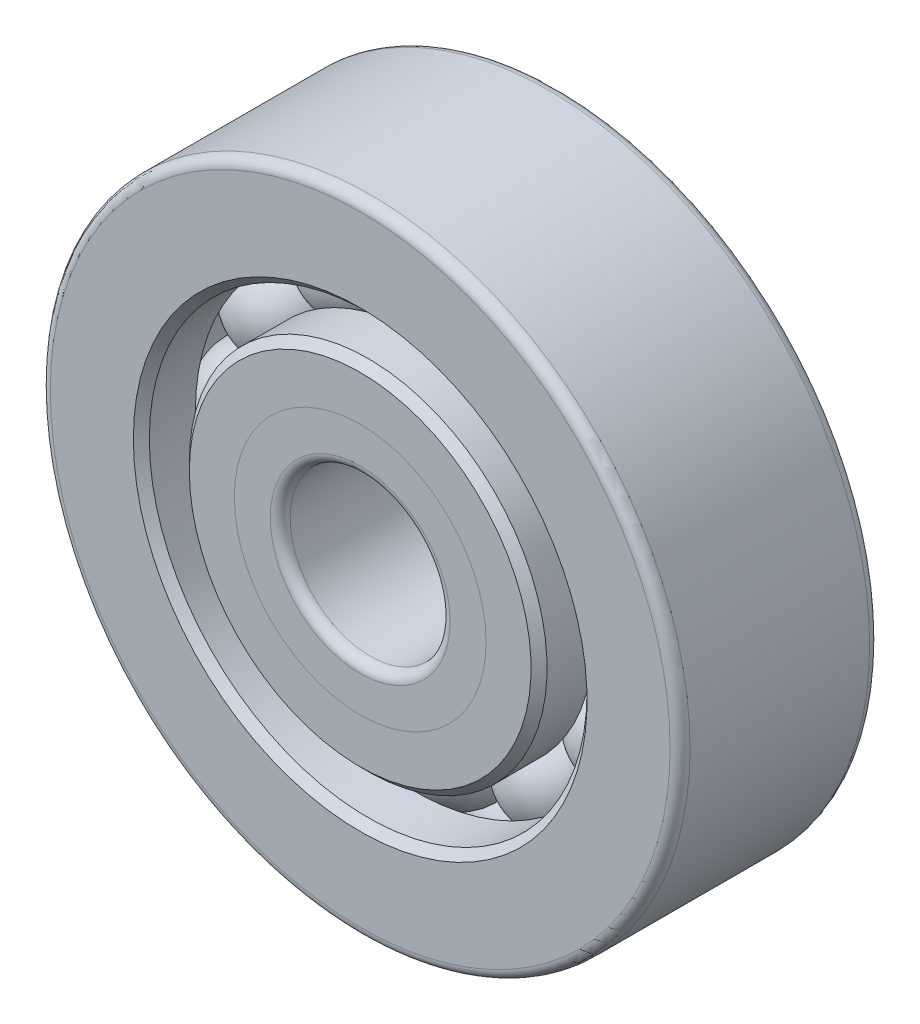
ISO-10303-21;
HEADER;
FILE_DESCRIPTION(('STEP AP214'),'2;1');
FILE_NAME('part.step','',(''),(''),'','','');
FILE_SCHEMA(('AUTOMOTIVE_DESIGN { 1 0 10303 214 1 1 1 1 }'));
ENDSEC;
DATA;
#1=APPLICATION_CONTEXT('core data for automotive mechanical design processes');
#2=APPLICATION_PROTOCOL_DEFINITION('international standard','automotive_design',2000,#1);
#3=PRODUCT_CONTEXT('',#1,'mechanical');
#4=PRODUCT('Part','Part','',(#3));
#5=PRODUCT_RELATED_PRODUCT_CATEGORY('part','',(#4));
#6=PRODUCT_DEFINITION_FORMATION('','',#4);
#7=PRODUCT_DEFINITION_CONTEXT('part definition',#1,'design');
#8=PRODUCT_DEFINITION('design','',#6,#7);
#9=PRODUCT_DEFINITION_SHAPE('','',#8);
#10=(LENGTH_UNIT() NAMED_UNIT(*) SI_UNIT(.MILLI.,.METRE.));
#11=(NAMED_UNIT(*) PLANE_ANGLE_UNIT() SI_UNIT($,.RADIAN.));
#12=(NAMED_UNIT(*) SI_UNIT($,.STERADIAN.) SOLID_ANGLE_UNIT());
#13=UNCERTAINTY_MEASURE_WITH_UNIT(LENGTH_MEASURE(1.E-05),#10,'distance_accuracy_value','');
#14=(GEOMETRIC_REPRESENTATION_CONTEXT(3) GLOBAL_UNCERTAINTY_ASSIGNED_CONTEXT((#13)) GLOBAL_UNIT_ASSIGNED_CONTEXT((#10,
#11,#12)) REPRESENTATION_CONTEXT('',''));
#15=CARTESIAN_POINT('',(0.,0.,0.));
#16=DIRECTION('',(0.,0.,1.));
#17=DIRECTION('',(1.,0.,0.));
#18=AXIS2_PLACEMENT_3D('',#15,#16,#17);
#19=CARTESIAN_POINT('',(0.,0.,-3.9724));
#20=DIRECTION('',(0.,0.,1.));
#21=DIRECTION('',(1.,0.,0.));
#22=AXIS2_PLACEMENT_3D('',#19,#20,#21);
#23=CYLINDRICAL_SURFACE('',#22,4.99872);
#24=CARTESIAN_POINT('',(0.,0.,-3.9624));
#25=DIRECTION('',(0.,0.,1.));
#26=DIRECTION('',(1.,0.,0.));
#27=AXIS2_PLACEMENT_3D('',#24,#25,#26);
#28=CIRCLE('',#27,4.99872);
#29=CARTESIAN_POINT('',(4.99872,0.,-3.9624));
#30=VERTEX_POINT('',#29);
#31=EDGE_CURVE('E78',#30,#30,#28,.T.);
#32=ORIENTED_EDGE('',*,*,#31,.T.);
#33=EDGE_LOOP('',(#32));
#34=FACE_BOUND('',#33,.T.);
#35=CARTESIAN_POINT('',(0.,0.,3.9624));
#36=DIRECTION('',(0.,0.,-1.));
#37=DIRECTION('',(-1.,0.,0.));
#38=AXIS2_PLACEMENT_3D('',#35,#36,#37);
#39=CIRCLE('',#38,4.99872);
#40=CARTESIAN_POINT('',(-4.99872,0.,3.9624));
#41=VERTEX_POINT('',#40);
#42=EDGE_CURVE('E62',#41,#41,#39,.T.);
#43=ORIENTED_EDGE('',*,*,#42,.T.);
#44=EDGE_LOOP('',(#43));
#45=FACE_BOUND('',#44,.T.);
#46=ADVANCED_FACE('F58',(#34,#45),#23,.T.);
#47=CARTESIAN_POINT('',(0.,3.175,-3.9624));
#48=DIRECTION('',(0.,0.,1.));
#49=DIRECTION('',(1.,0.,0.));
#50=AXIS2_PLACEMENT_3D('',#47,#48,#49);
#51=PLANE('',#50);
#52=CARTESIAN_POINT('',(0.,0.,-3.9624));
#53=DIRECTION('',(0.,0.,1.));
#54=DIRECTION('',(1.,0.,0.));
#55=AXIS2_PLACEMENT_3D('',#52,#53,#54);
#56=CIRCLE('',#55,3.57124);
#57=CARTESIAN_POINT('',(3.57124,0.,-3.9624));
#58=VERTEX_POINT('',#57);
#59=EDGE_CURVE('E11',#58,#58,#56,.T.);
#60=ORIENTED_EDGE('',*,*,#59,.T.);
#61=EDGE_LOOP('',(#60));
#62=FACE_BOUND('',#61,.T.);
#63=ORIENTED_EDGE('',*,*,#31,.F.);
#64=EDGE_LOOP('',(#63));
#65=FACE_BOUND('',#64,.T.);
#66=ADVANCED_FACE('F60',(#62,#65),#51,.F.);
#67=CARTESIAN_POINT('',(0.,7.101586,3.9624));
#68=DIRECTION('',(0.,0.,-1.));
#69=DIRECTION('',(-1.,0.,0.));
#70=AXIS2_PLACEMENT_3D('',#67,#68,#69);
#71=PLANE('',#70);
#72=CARTESIAN_POINT('',(0.,0.,3.9624));
#73=DIRECTION('',(0.,0.,-1.));
#74=DIRECTION('',(-1.,0.,0.));
#75=AXIS2_PLACEMENT_3D('',#72,#73,#74);
#76=CIRCLE('',#75,3.57124);
#77=CARTESIAN_POINT('',(-3.57124,0.,3.9624));
#78=VERTEX_POINT('',#77);
#79=EDGE_CURVE('E80',#78,#78,#76,.T.);
#80=ORIENTED_EDGE('',*,*,#79,.T.);
#81=EDGE_LOOP('',(#80));
#82=FACE_BOUND('',#81,.T.);
#83=ORIENTED_EDGE('',*,*,#42,.F.);
#84=EDGE_LOOP('',(#83));
#85=FACE_BOUND('',#84,.T.);
#86=ADVANCED_FACE('F91',(#82,#85),#71,.F.);
#87=CARTESIAN_POINT('',(0.,0.,3.9624));
#88=DIRECTION('',(0.,0.,1.));
#89=DIRECTION('',(1.,0.,0.));
#90=AXIS2_PLACEMENT_3D('',#87,#88,#89);
#91=CYLINDRICAL_SURFACE('',#90,3.175);
#92=CARTESIAN_POINT('',(0.,0.,-3.56616));
#93=DIRECTION('',(0.,0.,1.));
#94=DIRECTION('',(1.,0.,0.));
#95=AXIS2_PLACEMENT_3D('',#92,#93,#94);
#96=CIRCLE('',#95,3.175);
#97=CARTESIAN_POINT('',(3.175,0.,-3.56616));
#98=VERTEX_POINT('',#97);
#99=EDGE_CURVE('E75',#98,#98,#96,.F.);
#100=ORIENTED_EDGE('',*,*,#99,.T.);
#101=EDGE_LOOP('',(#100));
#102=FACE_BOUND('',#101,.T.);
#103=CARTESIAN_POINT('',(0.,0.,3.56616));
#104=DIRECTION('',(0.,0.,-1.));
#105=DIRECTION('',(-1.,0.,0.));
#106=AXIS2_PLACEMENT_3D('',#103,#104,#105);
#107=CIRCLE('',#106,3.175);
#108=CARTESIAN_POINT('',(-3.175,0.,3.56616));
#109=VERTEX_POINT('',#108);
#110=EDGE_CURVE('E67',#109,#109,#107,.F.);
#111=ORIENTED_EDGE('',*,*,#110,.T.);
#112=EDGE_LOOP('',(#111));
#113=FACE_BOUND('',#112,.T.);
#114=ADVANCED_FACE('F93',(#102,#113),#91,.F.);
#115=CARTESIAN_POINT('',(0.,0.,-3.56616));
#116=DIRECTION('',(0.,0.,1.));
#117=DIRECTION('',(1.,0.,0.));
#118=AXIS2_PLACEMENT_3D('',#115,#116,#117);
#119=TOROIDAL_SURFACE('',#118,3.57124,0.39624);
#120=ORIENTED_EDGE('',*,*,#99,.F.);
#121=EDGE_LOOP('',(#120));
#122=FACE_BOUND('',#121,.T.);
#123=ORIENTED_EDGE('',*,*,#59,.F.);
#124=EDGE_LOOP('',(#123));
#125=FACE_BOUND('',#124,.T.);
#126=ADVANCED_FACE('F98',(#122,#125),#119,.T.);
#127=CARTESIAN_POINT('',(0.,0.,3.56616));
#128=DIRECTION('',(0.,0.,-1.));
#129=DIRECTION('',(-1.,0.,0.));
#130=AXIS2_PLACEMENT_3D('',#127,#128,#129);
#131=TOROIDAL_SURFACE('',#130,3.57124,0.39624);
#132=ORIENTED_EDGE('',*,*,#79,.F.);
#133=EDGE_LOOP('',(#132));
#134=FACE_BOUND('',#133,.T.);
#135=ORIENTED_EDGE('',*,*,#110,.F.);
#136=EDGE_LOOP('',(#135));
#137=FACE_BOUND('',#136,.T.);
#138=ADVANCED_FACE('F104',(#134,#137),#131,.T.);
#139=CLOSED_SHELL('',(#46,#66,#86,#114,#126,#138));
#140=MANIFOLD_SOLID_BREP('B2',#139);
#141=CARTESIAN_POINT('',(0.,0.,-3.9724));
#142=DIRECTION('',(0.,0.,1.));
#143=DIRECTION('',(1.,0.,0.));
#144=AXIS2_PLACEMENT_3D('',#141,#142,#143);
#145=CYLINDRICAL_SURFACE('',#144,4.99872);
#146=CARTESIAN_POINT('',(0.,0.,3.9624));
#147=DIRECTION('',(0.,0.,-1.));
#148=DIRECTION('',(-1.,0.,0.));
#149=AXIS2_PLACEMENT_3D('',#146,#147,#148);
#150=CIRCLE('',#149,4.99872);
#151=CARTESIAN_POINT('',(-4.99872,0.,3.9624));
#152=VERTEX_POINT('',#151);
#153=EDGE_CURVE('E163',#152,#152,#150,.T.);
#154=ORIENTED_EDGE('',*,*,#153,.F.);
#155=EDGE_LOOP('',(#154));
#156=FACE_BOUND('',#155,.T.);
#157=CARTESIAN_POINT('',(0.,0.,-3.9624));
#158=DIRECTION('',(0.,0.,1.));
#159=DIRECTION('',(1.,0.,0.));
#160=AXIS2_PLACEMENT_3D('',#157,#158,#159);
#161=CIRCLE('',#160,4.99872);
#162=CARTESIAN_POINT('',(4.99872,0.,-3.9624));
#163=VERTEX_POINT('',#162);
#164=EDGE_CURVE('E57',#163,#163,#161,.T.);
#165=ORIENTED_EDGE('',*,*,#164,.F.);
#166=EDGE_LOOP('',(#165));
#167=FACE_BOUND('',#166,.T.);
#168=ADVANCED_FACE('F156',(#156,#167),#145,.F.);
#169=CARTESIAN_POINT('',(0.,0.,0.));
#170=DIRECTION('',(0.,0.,1.));
#171=DIRECTION('',(1.,0.,0.));
#172=AXIS2_PLACEMENT_3D('',#169,#170,#171);
#173=TOROIDAL_SURFACE('',#172,7.89559,1.98501);
#174=CARTESIAN_POINT('',(0.,0.,-1.81929171604886));
#175=DIRECTION('',(0.,0.,1.));
#176=DIRECTION('',(1.,0.,0.));
#177=AXIS2_PLACEMENT_3D('',#174,#175,#176);
#178=CIRCLE('',#177,7.101586);
#179=CARTESIAN_POINT('',(7.101586,0.,-1.81929171604886));
#180=VERTEX_POINT('',#179);
#181=EDGE_CURVE('E191',#180,#180,#178,.T.);
#182=ORIENTED_EDGE('',*,*,#181,.T.);
#183=EDGE_LOOP('',(#182));
#184=FACE_BOUND('',#183,.T.);
#185=CARTESIAN_POINT('',(0.,0.,1.81929171604886));
#186=DIRECTION('',(0.,0.,-1.));
#187=DIRECTION('',(-1.,0.,0.));
#188=AXIS2_PLACEMENT_3D('',#185,#186,#187);
#189=CIRCLE('',#188,7.101586);
#190=CARTESIAN_POINT('',(-7.101586,0.,1.81929171604886));
#191=VERTEX_POINT('',#190);
#192=EDGE_CURVE('E187',#191,#191,#189,.T.);
#193=ORIENTED_EDGE('',*,*,#192,.T.);
#194=EDGE_LOOP('',(#193));
#195=FACE_BOUND('',#194,.T.);
#196=ADVANCED_FACE('F196',(#184,#195),#173,.F.);
#197=CARTESIAN_POINT('',(0.,0.,3.9624));
#198=DIRECTION('',(0.,0.,1.));
#199=DIRECTION('',(1.,0.,0.));
#200=AXIS2_PLACEMENT_3D('',#197,#198,#199);
#201=CYLINDRICAL_SURFACE('',#200,7.101586);
#202=CARTESIAN_POINT('',(0.,0.,3.645408));
#203=DIRECTION('',(0.,0.,-1.));
#204=DIRECTION('',(-1.,0.,0.));
#205=AXIS2_PLACEMENT_3D('',#202,#203,#204);
#206=CIRCLE('',#205,7.101586);
#207=CARTESIAN_POINT('',(-7.101586,0.,3.645408));
#208=VERTEX_POINT('',#207);
#209=EDGE_CURVE('E169',#208,#208,#206,.T.);
#210=ORIENTED_EDGE('',*,*,#209,.T.);
#211=EDGE_LOOP('',(#210));
#212=FACE_BOUND('',#211,.T.);
#213=ORIENTED_EDGE('',*,*,#192,.F.);
#214=EDGE_LOOP('',(#213));
#215=FACE_BOUND('',#214,.T.);
#216=ADVANCED_FACE('F205',(#212,#215),#201,.T.);
#217=CARTESIAN_POINT('',(0.,0.,3.9624));
#218=DIRECTION('',(0.,0.,-1.));
#219=DIRECTION('',(-1.,0.,0.));
#220=AXIS2_PLACEMENT_3D('',#217,#218,#219);
#221=CONICAL_SURFACE('',#220,6.784594,0.785398163397446);
#222=ORIENTED_EDGE('',*,*,#209,.F.);
#223=EDGE_LOOP('',(#222));
#224=FACE_BOUND('',#223,.T.);
#225=CARTESIAN_POINT('',(0.,0.,3.9624));
#226=DIRECTION('',(0.,0.,-1.));
#227=DIRECTION('',(-1.,0.,0.));
#228=AXIS2_PLACEMENT_3D('',#225,#226,#227);
#229=CIRCLE('',#228,6.784594);
#230=CARTESIAN_POINT('',(-6.784594,0.,3.9624));
#231=VERTEX_POINT('',#230);
#232=EDGE_CURVE('E174',#231,#231,#229,.F.);
#233=ORIENTED_EDGE('',*,*,#232,.F.);
#234=EDGE_LOOP('',(#233));
#235=FACE_BOUND('',#234,.T.);
#236=ADVANCED_FACE('F214',(#224,#235),#221,.T.);
#237=CARTESIAN_POINT('',(0.,7.101586,3.9624));
#238=DIRECTION('',(0.,0.,-1.));
#239=DIRECTION('',(-1.,0.,0.));
#240=AXIS2_PLACEMENT_3D('',#237,#238,#239);
#241=PLANE('',#240);
#242=ORIENTED_EDGE('',*,*,#153,.T.);
#243=EDGE_LOOP('',(#242));
#244=FACE_BOUND('',#243,.T.);
#245=ORIENTED_EDGE('',*,*,#232,.T.);
#246=EDGE_LOOP('',(#245));
#247=FACE_BOUND('',#246,.T.);
#248=ADVANCED_FACE('F202',(#244,#247),#241,.F.);
#249=CARTESIAN_POINT('',(0.,0.,-3.645408));
#250=DIRECTION('',(0.,0.,1.));
#251=DIRECTION('',(1.,0.,0.));
#252=AXIS2_PLACEMENT_3D('',#249,#250,#251);
#253=CIRCLE('',#252,7.101586);
#254=CARTESIAN_POINT('',(7.101586,0.,-3.645408));
#255=VERTEX_POINT('',#254);
#256=EDGE_CURVE('E184',#255,#255,#253,.T.);
#257=ORIENTED_EDGE('',*,*,#256,.T.);
#258=EDGE_LOOP('',(#257));
#259=FACE_BOUND('',#258,.T.);
#260=ORIENTED_EDGE('',*,*,#181,.F.);
#261=EDGE_LOOP('',(#260));
#262=FACE_BOUND('',#261,.T.);
#263=ADVANCED_FACE('F199',(#259,#262),#201,.T.);
#264=CARTESIAN_POINT('',(0.,0.,-3.645408));
#265=DIRECTION('',(0.,0.,1.));
#266=DIRECTION('',(1.,0.,0.));
#267=AXIS2_PLACEMENT_3D('',#264,#265,#266);
#268=CONICAL_SURFACE('',#267,7.101586,0.785398163397447);
#269=CARTESIAN_POINT('',(0.,0.,-3.9624));
#270=DIRECTION('',(0.,0.,1.));
#271=DIRECTION('',(1.,0.,0.));
#272=AXIS2_PLACEMENT_3D('',#269,#270,#271);
#273=CIRCLE('',#272,6.784594);
#274=CARTESIAN_POINT('',(6.784594,0.,-3.9624));
#275=VERTEX_POINT('',#274);
#276=EDGE_CURVE('E180',#275,#275,#273,.F.);
#277=ORIENTED_EDGE('',*,*,#276,.F.);
#278=EDGE_LOOP('',(#277));
#279=FACE_BOUND('',#278,.T.);
#280=ORIENTED_EDGE('',*,*,#256,.F.);
#281=EDGE_LOOP('',(#280));
#282=FACE_BOUND('',#281,.T.);
#283=ADVANCED_FACE('F201',(#279,#282),#268,.T.);
#284=CARTESIAN_POINT('',(0.,3.175,-3.9624));
#285=DIRECTION('',(0.,0.,1.));
#286=DIRECTION('',(1.,0.,0.));
#287=AXIS2_PLACEMENT_3D('',#284,#285,#286);
#288=PLANE('',#287);
#289=ORIENTED_EDGE('',*,*,#164,.T.);
#290=EDGE_LOOP('',(#289));
#291=FACE_BOUND('',#290,.T.);
#292=ORIENTED_EDGE('',*,*,#276,.T.);
#293=EDGE_LOOP('',(#292));
#294=FACE_BOUND('',#293,.T.);
#295=ADVANCED_FACE('F210',(#291,#294),#288,.F.);
#296=CLOSED_SHELL('',(#168,#196,#216,#236,#248,#263,#283,#295));
#297=MANIFOLD_SOLID_BREP('B6',#296);
#298=CARTESIAN_POINT('',(-3.94779499999991,6.83778151786643,0.));
#299=DIRECTION('',(0.,0.,1.));
#300=DIRECTION('',(-0.499999999999989,0.866025403784445,0.));
#301=AXIS2_PLACEMENT_3D('',#298,#299,#300);
#302=SPHERICAL_SURFACE('',#301,1.98501);
#303=CARTESIAN_POINT('',(-3.94779499999991,6.83778151786643,1.98501));
#304=VERTEX_POINT('',#303);
#305=VERTEX_LOOP('',#304);
#306=FACE_BOUND('',#305,.T.);
#307=ADVANCED_FACE('F283',(#306),#302,.T.);
#308=CLOSED_SHELL('',(#307));
#309=MANIFOLD_SOLID_BREP('B52',#308);
#310=CARTESIAN_POINT('',(-6.83778151786633,3.94779500000008,0.));
#311=DIRECTION('',(0.,0.,1.));
#312=DIRECTION('',(-0.866025403784433,0.50000000000001,0.));
#313=AXIS2_PLACEMENT_3D('',#310,#311,#312);
#314=SPHERICAL_SURFACE('',#313,1.98501);
#315=CARTESIAN_POINT('',(-6.83778151786633,3.94779500000008,1.98501));
#316=VERTEX_POINT('',#315);
#317=VERTEX_LOOP('',#316);
#318=FACE_BOUND('',#317,.T.);
#319=ADVANCED_FACE('F303',(#318),#314,.T.);
#320=CLOSED_SHELL('',(#319));
#321=MANIFOLD_SOLID_BREP('B152',#320);
#322=CARTESIAN_POINT('',(-7.89559,0.,0.));
#323=DIRECTION('',(0.,0.,1.));
#324=DIRECTION('',(-1.,0.,0.));
#325=AXIS2_PLACEMENT_3D('',#322,#323,#324);
#326=SPHERICAL_SURFACE('',#325,1.98501);
#327=CARTESIAN_POINT('',(-7.89559,0.,1.98501));
#328=VERTEX_POINT('',#327);
#329=VERTEX_LOOP('',#328);
#330=FACE_BOUND('',#329,.T.);
#331=ADVANCED_FACE('F322',(#330),#326,.T.);
#332=CLOSED_SHELL('',(#331));
#333=MANIFOLD_SOLID_BREP('B279',#332);
#334=CARTESIAN_POINT('',(-6.83778151786641,-3.94779499999994,0.));
#335=DIRECTION('',(0.,0.,1.));
#336=DIRECTION('',(-0.866025403784443,-0.499999999999992,0.));
#337=AXIS2_PLACEMENT_3D('',#334,#335,#336);
#338=SPHERICAL_SURFACE('',#337,1.98501);
#339=CARTESIAN_POINT('',(-6.83778151786641,-3.94779499999994,1.98501));
#340=VERTEX_POINT('',#339);
#341=VERTEX_LOOP('',#340);
#342=FACE_BOUND('',#341,.T.);
#343=ADVANCED_FACE('F342',(#342),#338,.T.);
#344=CLOSED_SHELL('',(#343));
#345=MANIFOLD_SOLID_BREP('B299',#344);
#346=CARTESIAN_POINT('',(-3.94779500000006,-6.83778151786635,0.));
#347=DIRECTION('',(0.,0.,1.));
#348=DIRECTION('',(-0.500000000000007,-0.866025403784435,0.));
#349=AXIS2_PLACEMENT_3D('',#346,#347,#348);
#350=SPHERICAL_SURFACE('',#349,1.98501);
#351=CARTESIAN_POINT('',(-3.94779500000006,-6.83778151786635,1.98501));
#352=VERTEX_POINT('',#351);
#353=VERTEX_LOOP('',#352);
#354=FACE_BOUND('',#353,.T.);
#355=ADVANCED_FACE('F362',(#354),#350,.T.);
#356=CLOSED_SHELL('',(#355));
#357=MANIFOLD_SOLID_BREP('B318',#356);
#358=CARTESIAN_POINT('',(0.,-7.89559,0.));
#359=DIRECTION('',(0.,0.,1.));
#360=DIRECTION('',(0.,-1.,0.));
#361=AXIS2_PLACEMENT_3D('',#358,#359,#360);
#362=SPHERICAL_SURFACE('',#361,1.98501);
#363=CARTESIAN_POINT('',(0.,-7.89559,1.98501));
#364=VERTEX_POINT('',#363);
#365=VERTEX_LOOP('',#364);
#366=FACE_BOUND('',#365,.T.);
#367=ADVANCED_FACE('F382',(#366),#362,.T.);
#368=CLOSED_SHELL('',(#367));
#369=MANIFOLD_SOLID_BREP('B338',#368);
#370=CARTESIAN_POINT('',(3.94779499999996,-6.8377815178664,0.));
#371=DIRECTION('',(0.,0.,1.));
#372=DIRECTION('',(0.499999999999995,-0.866025403784442,0.));
#373=AXIS2_PLACEMENT_3D('',#370,#371,#372);
#374=SPHERICAL_SURFACE('',#373,1.98501);
#375=CARTESIAN_POINT('',(3.94779499999996,-6.8377815178664,1.98501));
#376=VERTEX_POINT('',#375);
#377=VERTEX_LOOP('',#376);
#378=FACE_BOUND('',#377,.T.);
#379=ADVANCED_FACE('F402',(#378),#374,.T.);
#380=CLOSED_SHELL('',(#379));
#381=MANIFOLD_SOLID_BREP('B358',#380);
#382=CARTESIAN_POINT('',(6.83778151786636,-3.94779500000003,0.));
#383=DIRECTION('',(0.,0.,1.));
#384=DIRECTION('',(0.866025403784436,-0.500000000000004,0.));
#385=AXIS2_PLACEMENT_3D('',#382,#383,#384);
#386=SPHERICAL_SURFACE('',#385,1.98501);
#387=CARTESIAN_POINT('',(6.83778151786636,-3.94779500000003,1.98501));
#388=VERTEX_POINT('',#387);
#389=VERTEX_LOOP('',#388);
#390=FACE_BOUND('',#389,.T.);
#391=ADVANCED_FACE('F422',(#390),#386,.T.);
#392=CLOSED_SHELL('',(#391));
#393=MANIFOLD_SOLID_BREP('B378',#392);
#394=CARTESIAN_POINT('',(7.89559,0.,0.));
#395=DIRECTION('',(0.,0.,1.));
#396=DIRECTION('',(1.,0.,0.));
#397=AXIS2_PLACEMENT_3D('',#394,#395,#396);
#398=SPHERICAL_SURFACE('',#397,1.98501);
#399=CARTESIAN_POINT('',(7.89559,0.,1.98501));
#400=VERTEX_POINT('',#399);
#401=VERTEX_LOOP('',#400);
#402=FACE_BOUND('',#401,.T.);
#403=ADVANCED_FACE('F442',(#402),#398,.T.);
#404=CLOSED_SHELL('',(#403));
#405=MANIFOLD_SOLID_BREP('B398',#404);
#406=CARTESIAN_POINT('',(6.83778151786639,3.94779499999999,0.));
#407=DIRECTION('',(0.,0.,1.));
#408=DIRECTION('',(0.86602540378444,0.499999999999998,0.));
#409=AXIS2_PLACEMENT_3D('',#406,#407,#408);
#410=SPHERICAL_SURFACE('',#409,1.98501);
#411=CARTESIAN_POINT('',(6.83778151786639,3.94779499999999,1.98501));
#412=VERTEX_POINT('',#411);
#413=VERTEX_LOOP('',#412);
#414=FACE_BOUND('',#413,.T.);
#415=ADVANCED_FACE('F462',(#414),#410,.T.);
#416=CLOSED_SHELL('',(#415));
#417=MANIFOLD_SOLID_BREP('B418',#416);
#418=CARTESIAN_POINT('',(3.94779500000001,6.83778151786637,0.));
#419=DIRECTION('',(0.,0.,1.));
#420=DIRECTION('',(0.500000000000001,0.866025403784438,0.));
#421=AXIS2_PLACEMENT_3D('',#418,#419,#420);
#422=SPHERICAL_SURFACE('',#421,1.98501);
#423=CARTESIAN_POINT('',(3.94779500000001,6.83778151786637,1.98501));
#424=VERTEX_POINT('',#423);
#425=VERTEX_LOOP('',#424);
#426=FACE_BOUND('',#425,.T.);
#427=ADVANCED_FACE('F481',(#426),#422,.T.);
#428=CLOSED_SHELL('',(#427));
#429=MANIFOLD_SOLID_BREP('B438',#428);
#430=CARTESIAN_POINT('',(0.,7.89559,0.));
#431=DIRECTION('',(0.,0.,1.));
#432=DIRECTION('',(0.,1.,0.));
#433=AXIS2_PLACEMENT_3D('',#430,#431,#432);
#434=SPHERICAL_SURFACE('',#433,1.98501);
#435=CARTESIAN_POINT('',(0.,7.89559,1.98501));
#436=VERTEX_POINT('',#435);
#437=VERTEX_LOOP('',#436);
#438=FACE_BOUND('',#437,.T.);
#439=ADVANCED_FACE('F504',(#438),#434,.T.);
#440=CLOSED_SHELL('',(#439));
#441=MANIFOLD_SOLID_BREP('B458',#440);
#442=CARTESIAN_POINT('',(0.,0.,3.9624));
#443=DIRECTION('',(0.,0.,1.));
#444=DIRECTION('',(1.,0.,0.));
#445=AXIS2_PLACEMENT_3D('',#442,#443,#444);
#446=CYLINDRICAL_SURFACE('',#445,8.689594);
#447=CARTESIAN_POINT('',(0.,0.,3.64540800000001));
#448=DIRECTION('',(0.,0.,-1.));
#449=DIRECTION('',(-1.,0.,0.));
#450=AXIS2_PLACEMENT_3D('',#447,#448,#449);
#451=CIRCLE('',#450,8.689594);
#452=CARTESIAN_POINT('',(-8.689594,0.,3.64540800000001));
#453=VERTEX_POINT('',#452);
#454=EDGE_CURVE('E530',#453,#453,#451,.F.);
#455=ORIENTED_EDGE('',*,*,#454,.T.);
#456=EDGE_LOOP('',(#455));
#457=FACE_BOUND('',#456,.T.);
#458=CARTESIAN_POINT('',(0.,0.,1.81929171604886));
#459=DIRECTION('',(0.,0.,-1.));
#460=DIRECTION('',(-1.,0.,0.));
#461=AXIS2_PLACEMENT_3D('',#458,#459,#460);
#462=CIRCLE('',#461,8.689594);
#463=CARTESIAN_POINT('',(-8.689594,0.,1.81929171604886));
#464=VERTEX_POINT('',#463);
#465=EDGE_CURVE('E563',#464,#464,#462,.F.);
#466=ORIENTED_EDGE('',*,*,#465,.F.);
#467=EDGE_LOOP('',(#466));
#468=FACE_BOUND('',#467,.T.);
#469=ADVANCED_FACE('F522',(#457,#468),#446,.F.);
#470=CARTESIAN_POINT('',(0.,0.,-3.645408));
#471=DIRECTION('',(0.,0.,1.));
#472=DIRECTION('',(1.,0.,0.));
#473=AXIS2_PLACEMENT_3D('',#470,#471,#472);
#474=CIRCLE('',#473,8.689594);
#475=CARTESIAN_POINT('',(8.689594,0.,-3.645408));
#476=VERTEX_POINT('',#475);
#477=EDGE_CURVE('E536',#476,#476,#474,.F.);
#478=ORIENTED_EDGE('',*,*,#477,.T.);
#479=EDGE_LOOP('',(#478));
#480=FACE_BOUND('',#479,.T.);
#481=CARTESIAN_POINT('',(0.,0.,-1.81929171604886));
#482=DIRECTION('',(0.,0.,1.));
#483=DIRECTION('',(1.,0.,0.));
#484=AXIS2_PLACEMENT_3D('',#481,#482,#483);
#485=CIRCLE('',#484,8.689594);
#486=CARTESIAN_POINT('',(8.689594,0.,-1.81929171604886));
#487=VERTEX_POINT('',#486);
#488=EDGE_CURVE('E566',#487,#487,#485,.F.);
#489=ORIENTED_EDGE('',*,*,#488,.F.);
#490=EDGE_LOOP('',(#489));
#491=FACE_BOUND('',#490,.T.);
#492=ADVANCED_FACE('F574',(#480,#491),#446,.F.);
#493=CARTESIAN_POINT('',(0.,0.,3.9624));
#494=DIRECTION('',(0.,0.,1.));
#495=DIRECTION('',(1.,0.,0.));
#496=AXIS2_PLACEMENT_3D('',#493,#494,#495);
#497=CYLINDRICAL_SURFACE('',#496,12.7);
#498=CARTESIAN_POINT('',(0.,0.,-3.56616));
#499=DIRECTION('',(0.,0.,1.));
#500=DIRECTION('',(1.,0.,0.));
#501=AXIS2_PLACEMENT_3D('',#498,#499,#500);
#502=CIRCLE('',#501,12.7);
#503=CARTESIAN_POINT('',(12.7,0.,-3.56616));
#504=VERTEX_POINT('',#503);
#505=EDGE_CURVE('E555',#504,#504,#502,.T.);
#506=ORIENTED_EDGE('',*,*,#505,.T.);
#507=EDGE_LOOP('',(#506));
#508=FACE_BOUND('',#507,.T.);
#509=CARTESIAN_POINT('',(0.,0.,3.56616));
#510=DIRECTION('',(0.,0.,-1.));
#511=DIRECTION('',(-1.,0.,0.));
#512=AXIS2_PLACEMENT_3D('',#509,#510,#511);
#513=CIRCLE('',#512,12.7);
#514=CARTESIAN_POINT('',(-12.7,0.,3.56616));
#515=VERTEX_POINT('',#514);
#516=EDGE_CURVE('E559',#515,#515,#513,.T.);
#517=ORIENTED_EDGE('',*,*,#516,.T.);
#518=EDGE_LOOP('',(#517));
#519=FACE_BOUND('',#518,.T.);
#520=ADVANCED_FACE('F576',(#508,#519),#497,.T.);
#521=CARTESIAN_POINT('',(0.,12.7,3.9624));
#522=DIRECTION('',(0.,0.,-1.));
#523=DIRECTION('',(-1.,0.,0.));
#524=AXIS2_PLACEMENT_3D('',#521,#522,#523);
#525=PLANE('',#524);
#526=CARTESIAN_POINT('',(0.,0.,3.9624));
#527=DIRECTION('',(0.,0.,-1.));
#528=DIRECTION('',(-1.,0.,0.));
#529=AXIS2_PLACEMENT_3D('',#526,#527,#528);
#530=CIRCLE('',#529,9.006586);
#531=CARTESIAN_POINT('',(-9.006586,0.,3.9624));
#532=VERTEX_POINT('',#531);
#533=EDGE_CURVE('E503',#532,#532,#530,.T.);
#534=ORIENTED_EDGE('',*,*,#533,.T.);
#535=EDGE_LOOP('',(#534));
#536=FACE_BOUND('',#535,.T.);
#537=CARTESIAN_POINT('',(0.,0.,3.9624));
#538=DIRECTION('',(0.,0.,-1.));
#539=DIRECTION('',(-1.,0.,0.));
#540=AXIS2_PLACEMENT_3D('',#537,#538,#539);
#541=CIRCLE('',#540,12.30376);
#542=CARTESIAN_POINT('',(-12.30376,0.,3.9624));
#543=VERTEX_POINT('',#542);
#544=EDGE_CURVE('E548',#543,#543,#541,.F.);
#545=ORIENTED_EDGE('',*,*,#544,.T.);
#546=EDGE_LOOP('',(#545));
#547=FACE_BOUND('',#546,.T.);
#548=ADVANCED_FACE('F582',(#536,#547),#525,.F.);
#549=CARTESIAN_POINT('',(0.,8.689594,-3.9624));
#550=DIRECTION('',(0.,0.,1.));
#551=DIRECTION('',(1.,0.,0.));
#552=AXIS2_PLACEMENT_3D('',#549,#550,#551);
#553=PLANE('',#552);
#554=CARTESIAN_POINT('',(0.,0.,-3.9624));
#555=DIRECTION('',(0.,0.,1.));
#556=DIRECTION('',(1.,0.,0.));
#557=AXIS2_PLACEMENT_3D('',#554,#555,#556);
#558=CIRCLE('',#557,9.006586);
#559=CARTESIAN_POINT('',(9.006586,0.,-3.9624));
#560=VERTEX_POINT('',#559);
#561=EDGE_CURVE('E542',#560,#560,#558,.T.);
#562=ORIENTED_EDGE('',*,*,#561,.T.);
#563=EDGE_LOOP('',(#562));
#564=FACE_BOUND('',#563,.T.);
#565=CARTESIAN_POINT('',(0.,0.,-3.9624));
#566=DIRECTION('',(0.,0.,1.));
#567=DIRECTION('',(1.,0.,0.));
#568=AXIS2_PLACEMENT_3D('',#565,#566,#567);
#569=CIRCLE('',#568,12.30376);
#570=CARTESIAN_POINT('',(12.30376,0.,-3.9624));
#571=VERTEX_POINT('',#570);
#572=EDGE_CURVE('E551',#571,#571,#569,.F.);
#573=ORIENTED_EDGE('',*,*,#572,.T.);
#574=EDGE_LOOP('',(#573));
#575=FACE_BOUND('',#574,.T.);
#576=ADVANCED_FACE('F588',(#564,#575),#553,.F.);
#577=CARTESIAN_POINT('',(0.,0.,0.));
#578=DIRECTION('',(0.,0.,1.));
#579=DIRECTION('',(1.,0.,0.));
#580=AXIS2_PLACEMENT_3D('',#577,#578,#579);
#581=TOROIDAL_SURFACE('',#580,7.89559,1.98501);
#582=ORIENTED_EDGE('',*,*,#488,.T.);
#583=EDGE_LOOP('',(#582));
#584=FACE_BOUND('',#583,.T.);
#585=ORIENTED_EDGE('',*,*,#465,.T.);
#586=EDGE_LOOP('',(#585));
#587=FACE_BOUND('',#586,.T.);
#588=ADVANCED_FACE('F571',(#584,#587),#581,.F.);
#589=CARTESIAN_POINT('',(0.,0.,-3.56616));
#590=DIRECTION('',(0.,0.,1.));
#591=DIRECTION('',(1.,0.,0.));
#592=AXIS2_PLACEMENT_3D('',#589,#590,#591);
#593=TOROIDAL_SURFACE('',#592,12.30376,0.39624);
#594=ORIENTED_EDGE('',*,*,#572,.F.);
#595=EDGE_LOOP('',(#594));
#596=FACE_BOUND('',#595,.T.);
#597=ORIENTED_EDGE('',*,*,#505,.F.);
#598=EDGE_LOOP('',(#597));
#599=FACE_BOUND('',#598,.T.);
#600=ADVANCED_FACE('F592',(#596,#599),#593,.T.);
#601=CARTESIAN_POINT('',(0.,0.,3.56616));
#602=DIRECTION('',(0.,0.,-1.));
#603=DIRECTION('',(-1.,0.,0.));
#604=AXIS2_PLACEMENT_3D('',#601,#602,#603);
#605=TOROIDAL_SURFACE('',#604,12.30376,0.39624);
#606=ORIENTED_EDGE('',*,*,#516,.F.);
#607=EDGE_LOOP('',(#606));
#608=FACE_BOUND('',#607,.T.);
#609=ORIENTED_EDGE('',*,*,#544,.F.);
#610=EDGE_LOOP('',(#609));
#611=FACE_BOUND('',#610,.T.);
#612=ADVANCED_FACE('F595',(#608,#611),#605,.T.);
#613=CARTESIAN_POINT('',(0.,0.,-3.9624));
#614=DIRECTION('',(0.,0.,-1.));
#615=DIRECTION('',(-1.,0.,0.));
#616=AXIS2_PLACEMENT_3D('',#613,#614,#615);
#617=CONICAL_SURFACE('',#616,9.006586,0.785398163397443);
#618=ORIENTED_EDGE('',*,*,#477,.F.);
#619=EDGE_LOOP('',(#618));
#620=FACE_BOUND('',#619,.T.);
#621=ORIENTED_EDGE('',*,*,#561,.F.);
#622=EDGE_LOOP('',(#621));
#623=FACE_BOUND('',#622,.T.);
#624=ADVANCED_FACE('F598',(#620,#623),#617,.F.);
#625=CARTESIAN_POINT('',(0.,0.,3.64540800000001));
#626=DIRECTION('',(0.,0.,1.));
#627=DIRECTION('',(1.,0.,0.));
#628=AXIS2_PLACEMENT_3D('',#625,#626,#627);
#629=CONICAL_SURFACE('',#628,8.689594,0.785398163397456);
#630=ORIENTED_EDGE('',*,*,#533,.F.);
#631=EDGE_LOOP('',(#630));
#632=FACE_BOUND('',#631,.T.);
#633=ORIENTED_EDGE('',*,*,#454,.F.);
#634=EDGE_LOOP('',(#633));
#635=FACE_BOUND('',#634,.T.);
#636=ADVANCED_FACE('F524',(#632,#635),#629,.F.);
#637=CLOSED_SHELL('',(#469,#492,#520,#548,#576,#588,#600,#612,#624,#636));
#638=MANIFOLD_SOLID_BREP('B477',#637);
#639=ADVANCED_BREP_SHAPE_REPRESENTATION('',(#18,#140,#297,#309,#321,#333,#345,#357,#369,#381,
#393,#405,#417,#429,#441,#638),#14);
#640=SHAPE_DEFINITION_REPRESENTATION(#9,#639);
ENDSEC;
END-ISO-10303-21;
